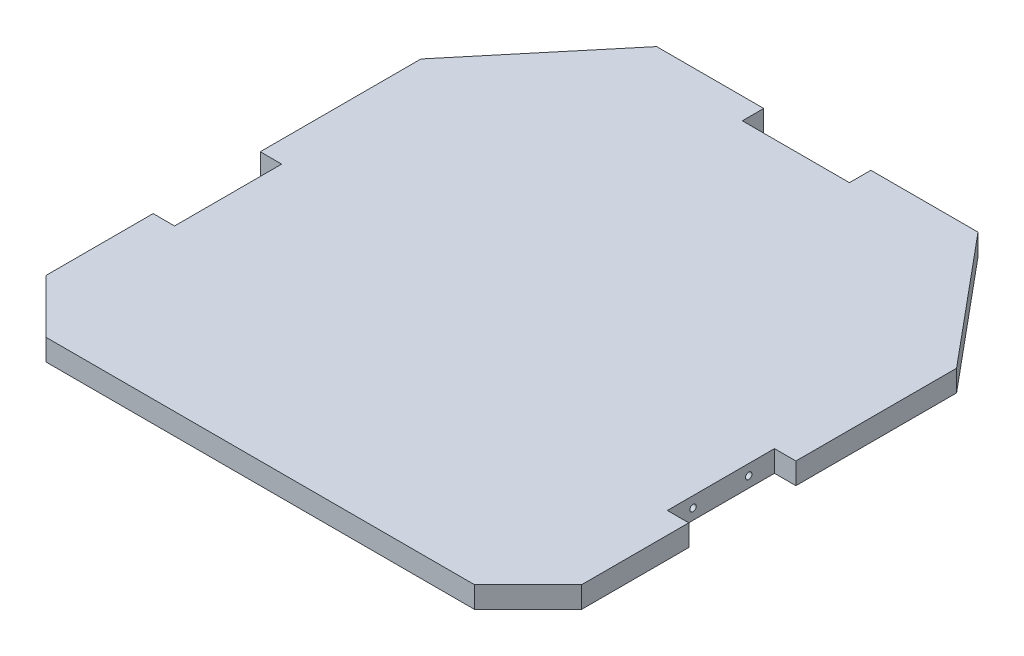
ISO-10303-21;
HEADER;
FILE_DESCRIPTION(('STEP AP214'),'2;1');
FILE_NAME('part.step','',(''),(''),'','','');
FILE_SCHEMA(('AUTOMOTIVE_DESIGN { 1 0 10303 214 1 1 1 1 }'));
ENDSEC;
DATA;
#1=APPLICATION_CONTEXT('core data for automotive mechanical design processes');
#2=APPLICATION_PROTOCOL_DEFINITION('international standard','automotive_design',2000,#1);
#3=PRODUCT_CONTEXT('',#1,'mechanical');
#4=PRODUCT('Part','Part','',(#3));
#5=PRODUCT_RELATED_PRODUCT_CATEGORY('part','',(#4));
#6=PRODUCT_DEFINITION_FORMATION('','',#4);
#7=PRODUCT_DEFINITION_CONTEXT('part definition',#1,'design');
#8=PRODUCT_DEFINITION('design','',#6,#7);
#9=PRODUCT_DEFINITION_SHAPE('','',#8);
#10=(LENGTH_UNIT() NAMED_UNIT(*) SI_UNIT(.MILLI.,.METRE.));
#11=(NAMED_UNIT(*) PLANE_ANGLE_UNIT() SI_UNIT($,.RADIAN.));
#12=(NAMED_UNIT(*) SI_UNIT($,.STERADIAN.) SOLID_ANGLE_UNIT());
#13=UNCERTAINTY_MEASURE_WITH_UNIT(LENGTH_MEASURE(1.E-05),#10,'distance_accuracy_value','');
#14=(GEOMETRIC_REPRESENTATION_CONTEXT(3) GLOBAL_UNCERTAINTY_ASSIGNED_CONTEXT((#13)) GLOBAL_UNIT_ASSIGNED_CONTEXT((#10,
#11,#12)) REPRESENTATION_CONTEXT('',''));
#15=CARTESIAN_POINT('',(0.,0.,0.));
#16=DIRECTION('',(0.,0.,1.));
#17=DIRECTION('',(1.,0.,0.));
#18=AXIS2_PLACEMENT_3D('',#15,#16,#17);
#19=CARTESIAN_POINT('',(115.,10.,-130.));
#20=DIRECTION('',(1.,0.,0.));
#21=DIRECTION('',(0.,0.,-1.));
#22=AXIS2_PLACEMENT_3D('',#19,#20,#21);
#23=PLANE('',#22);
#24=CARTESIAN_POINT('',(115.,5.,-113.));
#25=DIRECTION('',(-1.,0.,0.));
#26=DIRECTION('',(0.,0.,1.));
#27=AXIS2_PLACEMENT_3D('',#24,#25,#26);
#28=CIRCLE('',#27,1.5);
#29=CARTESIAN_POINT('',(115.,5.,-111.5));
#30=VERTEX_POINT('',#29);
#31=EDGE_CURVE('E615',#30,#30,#28,.T.);
#32=ORIENTED_EDGE('',*,*,#31,.T.);
#33=EDGE_LOOP('',(#32));
#34=FACE_BOUND('',#33,.T.);
#35=DIRECTION('',(0.,0.,1.));
#36=VECTOR('',#35,1.);
#37=CARTESIAN_POINT('',(115.,0.,-130.));
#38=LINE('',#37,#36);
#39=CARTESIAN_POINT('',(115.,0.,-125.));
#40=VERTEX_POINT('',#39);
#41=CARTESIAN_POINT('',(115.,0.,-75.));
#42=VERTEX_POINT('',#41);
#43=EDGE_CURVE('E205',#40,#42,#38,.T.);
#44=ORIENTED_EDGE('',*,*,#43,.F.);
#45=DIRECTION('',(0.,-1.,0.));
#46=VECTOR('',#45,1.);
#47=CARTESIAN_POINT('',(115.,10.,-125.));
#48=LINE('',#47,#46);
#49=CARTESIAN_POINT('',(115.,10.,-125.));
#50=VERTEX_POINT('',#49);
#51=EDGE_CURVE('E285',#50,#40,#48,.T.);
#52=ORIENTED_EDGE('',*,*,#51,.F.);
#53=DIRECTION('',(0.,0.,1.));
#54=VECTOR('',#53,1.);
#55=CARTESIAN_POINT('',(115.,10.,-130.));
#56=LINE('',#55,#54);
#57=CARTESIAN_POINT('',(115.,10.,-75.));
#58=VERTEX_POINT('',#57);
#59=EDGE_CURVE('E292',#50,#58,#56,.T.);
#60=ORIENTED_EDGE('',*,*,#59,.T.);
#61=DIRECTION('',(0.,-1.,0.));
#62=VECTOR('',#61,1.);
#63=CARTESIAN_POINT('',(115.,10.,-75.));
#64=LINE('',#63,#62);
#65=EDGE_CURVE('E42',#58,#42,#64,.T.);
#66=ORIENTED_EDGE('',*,*,#65,.T.);
#67=EDGE_LOOP('',(#44,#52,#60,#66));
#68=FACE_BOUND('',#67,.T.);
#69=CARTESIAN_POINT('',(115.,5.,-87.));
#70=DIRECTION('',(-1.,0.,0.));
#71=DIRECTION('',(0.,0.,1.));
#72=AXIS2_PLACEMENT_3D('',#69,#70,#71);
#73=CIRCLE('',#72,1.5);
#74=CARTESIAN_POINT('',(115.,5.,-85.5));
#75=VERTEX_POINT('',#74);
#76=EDGE_CURVE('E610',#75,#75,#73,.T.);
#77=ORIENTED_EDGE('',*,*,#76,.T.);
#78=EDGE_LOOP('',(#77));
#79=FACE_BOUND('',#78,.T.);
#80=ADVANCED_FACE('F33',(#34,#68,#79),#23,.T.);
#81=CARTESIAN_POINT('',(125.,10.,-130.));
#82=DIRECTION('',(1.,0.,0.));
#83=DIRECTION('',(0.,0.,-1.));
#84=AXIS2_PLACEMENT_3D('',#81,#82,#83);
#85=PLANE('',#84);
#86=DIRECTION('',(0.,0.,1.));
#87=VECTOR('',#86,1.);
#88=CARTESIAN_POINT('',(125.,0.,-130.));
#89=LINE('',#88,#87);
#90=CARTESIAN_POINT('',(125.,0.,-75.));
#91=VERTEX_POINT('',#90);
#92=CARTESIAN_POINT('',(125.,0.,-25.));
#93=VERTEX_POINT('',#92);
#94=EDGE_CURVE('E199',#91,#93,#89,.T.);
#95=ORIENTED_EDGE('',*,*,#94,.F.);
#96=DIRECTION('',(0.,-1.,0.));
#97=VECTOR('',#96,1.);
#98=CARTESIAN_POINT('',(125.,10.,-75.));
#99=LINE('',#98,#97);
#100=CARTESIAN_POINT('',(125.,10.,-75.));
#101=VERTEX_POINT('',#100);
#102=EDGE_CURVE('E11',#101,#91,#99,.T.);
#103=ORIENTED_EDGE('',*,*,#102,.F.);
#104=DIRECTION('',(0.,0.,1.));
#105=VECTOR('',#104,1.);
#106=CARTESIAN_POINT('',(125.,10.,-130.));
#107=LINE('',#106,#105);
#108=CARTESIAN_POINT('',(125.,10.,-25.));
#109=VERTEX_POINT('',#108);
#110=EDGE_CURVE('E249',#101,#109,#107,.T.);
#111=ORIENTED_EDGE('',*,*,#110,.T.);
#112=DIRECTION('',(0.,-1.,0.));
#113=VECTOR('',#112,1.);
#114=CARTESIAN_POINT('',(125.,10.,-25.));
#115=LINE('',#114,#113);
#116=EDGE_CURVE('E50',#109,#93,#115,.T.);
#117=ORIENTED_EDGE('',*,*,#116,.T.);
#118=EDGE_LOOP('',(#95,#103,#111,#117));
#119=FACE_BOUND('',#118,.T.);
#120=ADVANCED_FACE('F35',(#119),#85,.T.);
#121=CARTESIAN_POINT('',(-280.695337743088,10.,-75.));
#122=DIRECTION('',(0.,0.,-1.));
#123=DIRECTION('',(-1.,0.,0.));
#124=AXIS2_PLACEMENT_3D('',#121,#122,#123);
#125=PLANE('',#124);
#126=DIRECTION('',(1.,0.,0.));
#127=VECTOR('',#126,1.);
#128=CARTESIAN_POINT('',(-280.695337743088,0.,-75.));
#129=LINE('',#128,#127);
#130=EDGE_CURVE('E201',#42,#91,#129,.T.);
#131=ORIENTED_EDGE('',*,*,#130,.F.);
#132=ORIENTED_EDGE('',*,*,#65,.F.);
#133=DIRECTION('',(1.,0.,0.));
#134=VECTOR('',#133,1.);
#135=CARTESIAN_POINT('',(-280.695337743088,10.,-75.));
#136=LINE('',#135,#134);
#137=EDGE_CURVE('E309',#58,#101,#136,.T.);
#138=ORIENTED_EDGE('',*,*,#137,.T.);
#139=ORIENTED_EDGE('',*,*,#102,.T.);
#140=EDGE_LOOP('',(#131,#132,#138,#139));
#141=FACE_BOUND('',#140,.T.);
#142=ADVANCED_FACE('F296',(#141),#125,.T.);
#143=CARTESIAN_POINT('',(-280.695337743088,10.,-125.));
#144=DIRECTION('',(0.,0.,1.));
#145=DIRECTION('',(1.,0.,0.));
#146=AXIS2_PLACEMENT_3D('',#143,#144,#145);
#147=PLANE('',#146);
#148=DIRECTION('',(-1.,0.,0.));
#149=VECTOR('',#148,1.);
#150=CARTESIAN_POINT('',(-280.695337743088,0.,-125.));
#151=LINE('',#150,#149);
#152=CARTESIAN_POINT('',(125.,0.,-125.));
#153=VERTEX_POINT('',#152);
#154=EDGE_CURVE('E208',#153,#40,#151,.T.);
#155=ORIENTED_EDGE('',*,*,#154,.F.);
#156=DIRECTION('',(0.,-1.,0.));
#157=VECTOR('',#156,1.);
#158=CARTESIAN_POINT('',(125.,10.,-125.));
#159=LINE('',#158,#157);
#160=CARTESIAN_POINT('',(125.,10.,-125.));
#161=VERTEX_POINT('',#160);
#162=EDGE_CURVE('E283',#161,#153,#159,.T.);
#163=ORIENTED_EDGE('',*,*,#162,.F.);
#164=DIRECTION('',(-1.,0.,0.));
#165=VECTOR('',#164,1.);
#166=CARTESIAN_POINT('',(-280.695337743088,10.,-125.));
#167=LINE('',#166,#165);
#168=EDGE_CURVE('E306',#161,#50,#167,.T.);
#169=ORIENTED_EDGE('',*,*,#168,.T.);
#170=ORIENTED_EDGE('',*,*,#51,.T.);
#171=EDGE_LOOP('',(#155,#163,#169,#170));
#172=FACE_BOUND('',#171,.T.);
#173=ADVANCED_FACE('F303',(#172),#147,.T.);
#174=CARTESIAN_POINT('',(125.,10.,-130.));
#175=DIRECTION('',(1.,0.,0.));
#176=DIRECTION('',(0.,0.,-1.));
#177=AXIS2_PLACEMENT_3D('',#174,#175,#176);
#178=PLANE('',#177);
#179=DIRECTION('',(0.,0.,1.));
#180=VECTOR('',#179,1.);
#181=CARTESIAN_POINT('',(125.,0.,-130.));
#182=LINE('',#181,#180);
#183=CARTESIAN_POINT('',(125.,0.,-200.));
#184=VERTEX_POINT('',#183);
#185=EDGE_CURVE('E211',#184,#153,#182,.T.);
#186=ORIENTED_EDGE('',*,*,#185,.F.);
#187=DIRECTION('',(0.,-1.,0.));
#188=VECTOR('',#187,1.);
#189=CARTESIAN_POINT('',(125.,10.,-200.));
#190=LINE('',#189,#188);
#191=CARTESIAN_POINT('',(125.,10.,-200.));
#192=VERTEX_POINT('',#191);
#193=EDGE_CURVE('E281',#192,#184,#190,.T.);
#194=ORIENTED_EDGE('',*,*,#193,.F.);
#195=DIRECTION('',(0.,0.,1.));
#196=VECTOR('',#195,1.);
#197=CARTESIAN_POINT('',(125.,10.,-130.));
#198=LINE('',#197,#196);
#199=EDGE_CURVE('E311',#192,#161,#198,.T.);
#200=ORIENTED_EDGE('',*,*,#199,.T.);
#201=ORIENTED_EDGE('',*,*,#162,.T.);
#202=EDGE_LOOP('',(#186,#194,#200,#201));
#203=FACE_BOUND('',#202,.T.);
#204=ADVANCED_FACE('F375',(#203),#178,.T.);
#205=CARTESIAN_POINT('',(-6.84235153405244,10.,-358.210821840863));
#206=DIRECTION('',(-0.768221279597376,0.,0.64018439966448));
#207=DIRECTION('',(0.64018439966448,0.,0.768221279597376));
#208=AXIS2_PLACEMENT_3D('',#205,#206,#207);
#209=PLANE('',#208);
#210=DIRECTION('',(-0.64018439966448,0.,-0.768221279597376));
#211=VECTOR('',#210,1.);
#212=CARTESIAN_POINT('',(-6.84235153405244,0.,-358.210821840863));
#213=LINE('',#212,#211);
#214=CARTESIAN_POINT('',(75.0000000000001,0.,-260.));
#215=VERTEX_POINT('',#214);
#216=EDGE_CURVE('E214',#184,#215,#213,.T.);
#217=ORIENTED_EDGE('',*,*,#216,.T.);
#218=DIRECTION('',(0.,-1.,0.));
#219=VECTOR('',#218,1.);
#220=CARTESIAN_POINT('',(75.0000000000001,10.,-260.));
#221=LINE('',#220,#219);
#222=CARTESIAN_POINT('',(75.0000000000001,10.,-260.));
#223=VERTEX_POINT('',#222);
#224=EDGE_CURVE('E278',#223,#215,#221,.T.);
#225=ORIENTED_EDGE('',*,*,#224,.F.);
#226=DIRECTION('',(-0.64018439966448,0.,-0.768221279597376));
#227=VECTOR('',#226,1.);
#228=CARTESIAN_POINT('',(-6.84235153405244,10.,-358.210821840863));
#229=LINE('',#228,#227);
#230=EDGE_CURVE('E317',#192,#223,#229,.T.);
#231=ORIENTED_EDGE('',*,*,#230,.F.);
#232=ORIENTED_EDGE('',*,*,#193,.T.);
#233=EDGE_LOOP('',(#217,#225,#231,#232));
#234=FACE_BOUND('',#233,.T.);
#235=ADVANCED_FACE('F379',(#234),#209,.F.);
#236=CARTESIAN_POINT('',(-280.695337743088,10.,-260.));
#237=DIRECTION('',(0.,0.,1.));
#238=DIRECTION('',(1.,0.,0.));
#239=AXIS2_PLACEMENT_3D('',#236,#237,#238);
#240=PLANE('',#239);
#241=DIRECTION('',(-1.,0.,0.));
#242=VECTOR('',#241,1.);
#243=CARTESIAN_POINT('',(-280.695337743088,0.,-260.));
#244=LINE('',#243,#242);
#245=CARTESIAN_POINT('',(25.,0.,-260.));
#246=VERTEX_POINT('',#245);
#247=EDGE_CURVE('E216',#215,#246,#244,.T.);
#248=ORIENTED_EDGE('',*,*,#247,.T.);
#249=DIRECTION('',(0.,-1.,0.));
#250=VECTOR('',#249,1.);
#251=CARTESIAN_POINT('',(25.,10.,-260.));
#252=LINE('',#251,#250);
#253=CARTESIAN_POINT('',(25.,10.,-260.));
#254=VERTEX_POINT('',#253);
#255=EDGE_CURVE('E275',#254,#246,#252,.T.);
#256=ORIENTED_EDGE('',*,*,#255,.F.);
#257=DIRECTION('',(-1.,0.,0.));
#258=VECTOR('',#257,1.);
#259=CARTESIAN_POINT('',(-280.695337743088,10.,-260.));
#260=LINE('',#259,#258);
#261=EDGE_CURVE('E319',#223,#254,#260,.T.);
#262=ORIENTED_EDGE('',*,*,#261,.F.);
#263=ORIENTED_EDGE('',*,*,#224,.T.);
#264=EDGE_LOOP('',(#248,#256,#262,#263));
#265=FACE_BOUND('',#264,.T.);
#266=ADVANCED_FACE('F384',(#265),#240,.F.);
#267=CARTESIAN_POINT('',(25.0000000000002,10.,-130.));
#268=DIRECTION('',(1.,0.,0.));
#269=DIRECTION('',(0.,0.,-1.));
#270=AXIS2_PLACEMENT_3D('',#267,#268,#269);
#271=PLANE('',#270);
#272=DIRECTION('',(0.,0.,1.));
#273=VECTOR('',#272,1.);
#274=CARTESIAN_POINT('',(25.0000000000002,0.,-130.));
#275=LINE('',#274,#273);
#276=CARTESIAN_POINT('',(25.0000000000001,0.,-250.));
#277=VERTEX_POINT('',#276);
#278=EDGE_CURVE('E218',#246,#277,#275,.T.);
#279=ORIENTED_EDGE('',*,*,#278,.T.);
#280=DIRECTION('',(0.,-1.,0.));
#281=VECTOR('',#280,1.);
#282=CARTESIAN_POINT('',(25.0000000000001,10.,-250.));
#283=LINE('',#282,#281);
#284=CARTESIAN_POINT('',(25.0000000000001,10.,-250.));
#285=VERTEX_POINT('',#284);
#286=EDGE_CURVE('E273',#285,#277,#283,.T.);
#287=ORIENTED_EDGE('',*,*,#286,.F.);
#288=DIRECTION('',(0.,0.,1.));
#289=VECTOR('',#288,1.);
#290=CARTESIAN_POINT('',(25.0000000000002,10.,-130.));
#291=LINE('',#290,#289);
#292=EDGE_CURVE('E321',#254,#285,#291,.T.);
#293=ORIENTED_EDGE('',*,*,#292,.F.);
#294=ORIENTED_EDGE('',*,*,#255,.T.);
#295=EDGE_LOOP('',(#279,#287,#293,#294));
#296=FACE_BOUND('',#295,.T.);
#297=ADVANCED_FACE('F390',(#296),#271,.F.);
#298=CARTESIAN_POINT('',(-280.695337743088,10.,-250.));
#299=DIRECTION('',(0.,0.,-1.));
#300=DIRECTION('',(-1.,0.,0.));
#301=AXIS2_PLACEMENT_3D('',#298,#299,#300);
#302=PLANE('',#301);
#303=CARTESIAN_POINT('',(-13.,5.,-250.));
#304=DIRECTION('',(0.,0.,-1.));
#305=DIRECTION('',(-1.,0.,0.));
#306=AXIS2_PLACEMENT_3D('',#303,#304,#305);
#307=CIRCLE('',#306,1.5);
#308=CARTESIAN_POINT('',(-14.5000000000001,5.,-250.));
#309=VERTEX_POINT('',#308);
#310=EDGE_CURVE('E601',#309,#309,#307,.T.);
#311=ORIENTED_EDGE('',*,*,#310,.F.);
#312=EDGE_LOOP('',(#311));
#313=FACE_BOUND('',#312,.T.);
#314=CARTESIAN_POINT('',(13.0000000000001,5.,-250.));
#315=DIRECTION('',(0.,0.,-1.));
#316=DIRECTION('',(-1.,0.,0.));
#317=AXIS2_PLACEMENT_3D('',#314,#315,#316);
#318=CIRCLE('',#317,1.5);
#319=CARTESIAN_POINT('',(11.5000000000001,5.,-250.));
#320=VERTEX_POINT('',#319);
#321=EDGE_CURVE('E600',#320,#320,#318,.T.);
#322=ORIENTED_EDGE('',*,*,#321,.F.);
#323=EDGE_LOOP('',(#322));
#324=FACE_BOUND('',#323,.T.);
#325=DIRECTION('',(1.,0.,0.));
#326=VECTOR('',#325,1.);
#327=CARTESIAN_POINT('',(-280.695337743088,0.,-250.));
#328=LINE('',#327,#326);
#329=CARTESIAN_POINT('',(-25.,0.,-250.));
#330=VERTEX_POINT('',#329);
#331=EDGE_CURVE('E221',#330,#277,#328,.T.);
#332=ORIENTED_EDGE('',*,*,#331,.F.);
#333=DIRECTION('',(0.,-1.,0.));
#334=VECTOR('',#333,1.);
#335=CARTESIAN_POINT('',(-25.,10.,-250.));
#336=LINE('',#335,#334);
#337=CARTESIAN_POINT('',(-25.,10.,-250.));
#338=VERTEX_POINT('',#337);
#339=EDGE_CURVE('E271',#338,#330,#336,.T.);
#340=ORIENTED_EDGE('',*,*,#339,.F.);
#341=DIRECTION('',(1.,0.,0.));
#342=VECTOR('',#341,1.);
#343=CARTESIAN_POINT('',(-280.695337743088,10.,-250.));
#344=LINE('',#343,#342);
#345=EDGE_CURVE('E323',#338,#285,#344,.T.);
#346=ORIENTED_EDGE('',*,*,#345,.T.);
#347=ORIENTED_EDGE('',*,*,#286,.T.);
#348=EDGE_LOOP('',(#332,#340,#346,#347));
#349=FACE_BOUND('',#348,.T.);
#350=ADVANCED_FACE('F394',(#313,#324,#349),#302,.T.);
#351=CARTESIAN_POINT('',(-25.0000000000001,10.,-130.));
#352=DIRECTION('',(1.,0.,0.));
#353=DIRECTION('',(0.,0.,-1.));
#354=AXIS2_PLACEMENT_3D('',#351,#352,#353);
#355=PLANE('',#354);
#356=DIRECTION('',(0.,0.,1.));
#357=VECTOR('',#356,1.);
#358=CARTESIAN_POINT('',(-25.0000000000001,0.,-130.));
#359=LINE('',#358,#357);
#360=CARTESIAN_POINT('',(-25.,0.,-260.));
#361=VERTEX_POINT('',#360);
#362=EDGE_CURVE('E224',#361,#330,#359,.T.);
#363=ORIENTED_EDGE('',*,*,#362,.F.);
#364=DIRECTION('',(0.,-1.,0.));
#365=VECTOR('',#364,1.);
#366=CARTESIAN_POINT('',(-25.,10.,-260.));
#367=LINE('',#366,#365);
#368=CARTESIAN_POINT('',(-25.,10.,-260.));
#369=VERTEX_POINT('',#368);
#370=EDGE_CURVE('E269',#369,#361,#367,.T.);
#371=ORIENTED_EDGE('',*,*,#370,.F.);
#372=DIRECTION('',(0.,0.,1.));
#373=VECTOR('',#372,1.);
#374=CARTESIAN_POINT('',(-25.0000000000001,10.,-130.));
#375=LINE('',#374,#373);
#376=EDGE_CURVE('E326',#369,#338,#375,.T.);
#377=ORIENTED_EDGE('',*,*,#376,.T.);
#378=ORIENTED_EDGE('',*,*,#339,.T.);
#379=EDGE_LOOP('',(#363,#371,#377,#378));
#380=FACE_BOUND('',#379,.T.);
#381=ADVANCED_FACE('F398',(#380),#355,.T.);
#382=CARTESIAN_POINT('',(-280.695337743088,10.,-260.));
#383=DIRECTION('',(0.,0.,-1.));
#384=DIRECTION('',(-1.,0.,0.));
#385=AXIS2_PLACEMENT_3D('',#382,#383,#384);
#386=PLANE('',#385);
#387=DIRECTION('',(1.,0.,0.));
#388=VECTOR('',#387,1.);
#389=CARTESIAN_POINT('',(-280.695337743088,0.,-260.));
#390=LINE('',#389,#388);
#391=CARTESIAN_POINT('',(-75.,0.,-260.));
#392=VERTEX_POINT('',#391);
#393=EDGE_CURVE('E227',#392,#361,#390,.T.);
#394=ORIENTED_EDGE('',*,*,#393,.F.);
#395=DIRECTION('',(0.,-1.,0.));
#396=VECTOR('',#395,1.);
#397=CARTESIAN_POINT('',(-75.,10.,-260.));
#398=LINE('',#397,#396);
#399=CARTESIAN_POINT('',(-75.,10.,-260.));
#400=VERTEX_POINT('',#399);
#401=EDGE_CURVE('E267',#400,#392,#398,.T.);
#402=ORIENTED_EDGE('',*,*,#401,.F.);
#403=DIRECTION('',(1.,0.,0.));
#404=VECTOR('',#403,1.);
#405=CARTESIAN_POINT('',(-280.695337743088,10.,-260.));
#406=LINE('',#405,#404);
#407=EDGE_CURVE('E329',#400,#369,#406,.T.);
#408=ORIENTED_EDGE('',*,*,#407,.T.);
#409=ORIENTED_EDGE('',*,*,#370,.T.);
#410=EDGE_LOOP('',(#394,#402,#408,#409));
#411=FACE_BOUND('',#410,.T.);
#412=ADVANCED_FACE('F402',(#411),#386,.T.);
#413=CARTESIAN_POINT('',(-223.235794157003,10.,-82.1170470115961));
#414=DIRECTION('',(-0.768221279597376,0.,-0.64018439966448));
#415=DIRECTION('',(-0.64018439966448,0.,0.768221279597376));
#416=AXIS2_PLACEMENT_3D('',#413,#414,#415);
#417=PLANE('',#416);
#418=DIRECTION('',(0.64018439966448,0.,-0.768221279597376));
#419=VECTOR('',#418,1.);
#420=CARTESIAN_POINT('',(-223.235794157003,0.,-82.1170470115961));
#421=LINE('',#420,#419);
#422=CARTESIAN_POINT('',(-125.,0.,-200.));
#423=VERTEX_POINT('',#422);
#424=EDGE_CURVE('E230',#423,#392,#421,.T.);
#425=ORIENTED_EDGE('',*,*,#424,.F.);
#426=DIRECTION('',(0.,-1.,0.));
#427=VECTOR('',#426,1.);
#428=CARTESIAN_POINT('',(-125.,10.,-200.));
#429=LINE('',#428,#427);
#430=CARTESIAN_POINT('',(-125.,10.,-200.));
#431=VERTEX_POINT('',#430);
#432=EDGE_CURVE('E265',#431,#423,#429,.T.);
#433=ORIENTED_EDGE('',*,*,#432,.F.);
#434=DIRECTION('',(0.64018439966448,0.,-0.768221279597376));
#435=VECTOR('',#434,1.);
#436=CARTESIAN_POINT('',(-223.235794157003,10.,-82.1170470115961));
#437=LINE('',#436,#435);
#438=EDGE_CURVE('E332',#431,#400,#437,.T.);
#439=ORIENTED_EDGE('',*,*,#438,.T.);
#440=ORIENTED_EDGE('',*,*,#401,.T.);
#441=EDGE_LOOP('',(#425,#433,#439,#440));
#442=FACE_BOUND('',#441,.T.);
#443=ADVANCED_FACE('F406',(#442),#417,.T.);
#444=CARTESIAN_POINT('',(-125.,10.,-130.));
#445=DIRECTION('',(1.,0.,0.));
#446=DIRECTION('',(0.,0.,-1.));
#447=AXIS2_PLACEMENT_3D('',#444,#445,#446);
#448=PLANE('',#447);
#449=DIRECTION('',(0.,0.,1.));
#450=VECTOR('',#449,1.);
#451=CARTESIAN_POINT('',(-125.,0.,-130.));
#452=LINE('',#451,#450);
#453=CARTESIAN_POINT('',(-125.,0.,-125.));
#454=VERTEX_POINT('',#453);
#455=EDGE_CURVE('E233',#423,#454,#452,.T.);
#456=ORIENTED_EDGE('',*,*,#455,.T.);
#457=DIRECTION('',(0.,-1.,0.));
#458=VECTOR('',#457,1.);
#459=CARTESIAN_POINT('',(-125.,10.,-125.));
#460=LINE('',#459,#458);
#461=CARTESIAN_POINT('',(-125.,10.,-125.));
#462=VERTEX_POINT('',#461);
#463=EDGE_CURVE('E262',#462,#454,#460,.T.);
#464=ORIENTED_EDGE('',*,*,#463,.F.);
#465=DIRECTION('',(0.,0.,1.));
#466=VECTOR('',#465,1.);
#467=CARTESIAN_POINT('',(-125.,10.,-130.));
#468=LINE('',#467,#466);
#469=EDGE_CURVE('E335',#431,#462,#468,.T.);
#470=ORIENTED_EDGE('',*,*,#469,.F.);
#471=ORIENTED_EDGE('',*,*,#432,.T.);
#472=EDGE_LOOP('',(#456,#464,#470,#471));
#473=FACE_BOUND('',#472,.T.);
#474=ADVANCED_FACE('F410',(#473),#448,.F.);
#475=CARTESIAN_POINT('',(-280.695337743088,10.,-125.));
#476=DIRECTION('',(0.,0.,-1.));
#477=DIRECTION('',(-1.,0.,0.));
#478=AXIS2_PLACEMENT_3D('',#475,#476,#477);
#479=PLANE('',#478);
#480=DIRECTION('',(1.,0.,0.));
#481=VECTOR('',#480,1.);
#482=CARTESIAN_POINT('',(-280.695337743088,0.,-125.));
#483=LINE('',#482,#481);
#484=CARTESIAN_POINT('',(-115.,0.,-125.));
#485=VERTEX_POINT('',#484);
#486=EDGE_CURVE('E235',#454,#485,#483,.T.);
#487=ORIENTED_EDGE('',*,*,#486,.T.);
#488=DIRECTION('',(0.,-1.,0.));
#489=VECTOR('',#488,1.);
#490=CARTESIAN_POINT('',(-115.,10.,-125.));
#491=LINE('',#490,#489);
#492=CARTESIAN_POINT('',(-115.,10.,-125.));
#493=VERTEX_POINT('',#492);
#494=EDGE_CURVE('E259',#493,#485,#491,.T.);
#495=ORIENTED_EDGE('',*,*,#494,.F.);
#496=DIRECTION('',(1.,0.,0.));
#497=VECTOR('',#496,1.);
#498=CARTESIAN_POINT('',(-280.695337743088,10.,-125.));
#499=LINE('',#498,#497);
#500=EDGE_CURVE('E337',#462,#493,#499,.T.);
#501=ORIENTED_EDGE('',*,*,#500,.F.);
#502=ORIENTED_EDGE('',*,*,#463,.T.);
#503=EDGE_LOOP('',(#487,#495,#501,#502));
#504=FACE_BOUND('',#503,.T.);
#505=ADVANCED_FACE('F414',(#504),#479,.F.);
#506=CARTESIAN_POINT('',(-115.,10.,-130.));
#507=DIRECTION('',(1.,0.,0.));
#508=DIRECTION('',(0.,0.,-1.));
#509=AXIS2_PLACEMENT_3D('',#506,#507,#508);
#510=PLANE('',#509);
#511=CARTESIAN_POINT('',(-115.,5.,-87.));
#512=DIRECTION('',(-1.,0.,0.));
#513=DIRECTION('',(0.,0.,1.));
#514=AXIS2_PLACEMENT_3D('',#511,#512,#513);
#515=CIRCLE('',#514,1.5);
#516=CARTESIAN_POINT('',(-115.,5.,-85.5));
#517=VERTEX_POINT('',#516);
#518=EDGE_CURVE('E621',#517,#517,#515,.T.);
#519=ORIENTED_EDGE('',*,*,#518,.F.);
#520=EDGE_LOOP('',(#519));
#521=FACE_BOUND('',#520,.T.);
#522=CARTESIAN_POINT('',(-115.,5.,-113.));
#523=DIRECTION('',(-1.,0.,0.));
#524=DIRECTION('',(0.,0.,1.));
#525=AXIS2_PLACEMENT_3D('',#522,#523,#524);
#526=CIRCLE('',#525,1.5);
#527=CARTESIAN_POINT('',(-115.,5.,-111.5));
#528=VERTEX_POINT('',#527);
#529=EDGE_CURVE('E626',#528,#528,#526,.T.);
#530=ORIENTED_EDGE('',*,*,#529,.F.);
#531=EDGE_LOOP('',(#530));
#532=FACE_BOUND('',#531,.T.);
#533=DIRECTION('',(0.,0.,1.));
#534=VECTOR('',#533,1.);
#535=CARTESIAN_POINT('',(-115.,0.,-130.));
#536=LINE('',#535,#534);
#537=CARTESIAN_POINT('',(-115.,0.,-75.));
#538=VERTEX_POINT('',#537);
#539=EDGE_CURVE('E237',#485,#538,#536,.T.);
#540=ORIENTED_EDGE('',*,*,#539,.T.);
#541=DIRECTION('',(0.,-1.,0.));
#542=VECTOR('',#541,1.);
#543=CARTESIAN_POINT('',(-115.,10.,-75.));
#544=LINE('',#543,#542);
#545=CARTESIAN_POINT('',(-115.,10.,-75.));
#546=VERTEX_POINT('',#545);
#547=EDGE_CURVE('E256',#546,#538,#544,.T.);
#548=ORIENTED_EDGE('',*,*,#547,.F.);
#549=DIRECTION('',(0.,0.,1.));
#550=VECTOR('',#549,1.);
#551=CARTESIAN_POINT('',(-115.,10.,-130.));
#552=LINE('',#551,#550);
#553=EDGE_CURVE('E339',#493,#546,#552,.T.);
#554=ORIENTED_EDGE('',*,*,#553,.F.);
#555=ORIENTED_EDGE('',*,*,#494,.T.);
#556=EDGE_LOOP('',(#540,#548,#554,#555));
#557=FACE_BOUND('',#556,.T.);
#558=ADVANCED_FACE('F418',(#521,#532,#557),#510,.F.);
#559=CARTESIAN_POINT('',(-280.695337743088,10.,-75.));
#560=DIRECTION('',(0.,0.,1.));
#561=DIRECTION('',(1.,0.,0.));
#562=AXIS2_PLACEMENT_3D('',#559,#560,#561);
#563=PLANE('',#562);
#564=DIRECTION('',(-1.,0.,0.));
#565=VECTOR('',#564,1.);
#566=CARTESIAN_POINT('',(-280.695337743088,0.,-75.));
#567=LINE('',#566,#565);
#568=CARTESIAN_POINT('',(-125.,0.,-75.));
#569=VERTEX_POINT('',#568);
#570=EDGE_CURVE('E239',#538,#569,#567,.T.);
#571=ORIENTED_EDGE('',*,*,#570,.T.);
#572=DIRECTION('',(0.,-1.,0.));
#573=VECTOR('',#572,1.);
#574=CARTESIAN_POINT('',(-125.,10.,-75.));
#575=LINE('',#574,#573);
#576=CARTESIAN_POINT('',(-125.,10.,-75.));
#577=VERTEX_POINT('',#576);
#578=EDGE_CURVE('E253',#577,#569,#575,.T.);
#579=ORIENTED_EDGE('',*,*,#578,.F.);
#580=DIRECTION('',(-1.,0.,0.));
#581=VECTOR('',#580,1.);
#582=CARTESIAN_POINT('',(-280.695337743088,10.,-75.));
#583=LINE('',#582,#581);
#584=EDGE_CURVE('E341',#546,#577,#583,.T.);
#585=ORIENTED_EDGE('',*,*,#584,.F.);
#586=ORIENTED_EDGE('',*,*,#547,.T.);
#587=EDGE_LOOP('',(#571,#579,#585,#586));
#588=FACE_BOUND('',#587,.T.);
#589=ADVANCED_FACE('F347',(#588),#563,.F.);
#590=CARTESIAN_POINT('',(-125.,10.,-130.));
#591=DIRECTION('',(1.,0.,0.));
#592=DIRECTION('',(0.,0.,-1.));
#593=AXIS2_PLACEMENT_3D('',#590,#591,#592);
#594=PLANE('',#593);
#595=DIRECTION('',(0.,0.,1.));
#596=VECTOR('',#595,1.);
#597=CARTESIAN_POINT('',(-125.,0.,-130.));
#598=LINE('',#597,#596);
#599=CARTESIAN_POINT('',(-125.,0.,-25.));
#600=VERTEX_POINT('',#599);
#601=EDGE_CURVE('E241',#569,#600,#598,.T.);
#602=ORIENTED_EDGE('',*,*,#601,.T.);
#603=DIRECTION('',(0.,-1.,0.));
#604=VECTOR('',#603,1.);
#605=CARTESIAN_POINT('',(-125.,10.,-25.));
#606=LINE('',#605,#604);
#607=CARTESIAN_POINT('',(-125.,10.,-25.));
#608=VERTEX_POINT('',#607);
#609=EDGE_CURVE('E191',#608,#600,#606,.T.);
#610=ORIENTED_EDGE('',*,*,#609,.F.);
#611=DIRECTION('',(0.,0.,1.));
#612=VECTOR('',#611,1.);
#613=CARTESIAN_POINT('',(-125.,10.,-130.));
#614=LINE('',#613,#612);
#615=EDGE_CURVE('E179',#577,#608,#614,.T.);
#616=ORIENTED_EDGE('',*,*,#615,.F.);
#617=ORIENTED_EDGE('',*,*,#578,.T.);
#618=EDGE_LOOP('',(#602,#610,#616,#617));
#619=FACE_BOUND('',#618,.T.);
#620=ADVANCED_FACE('F351',(#619),#594,.F.);
#621=CARTESIAN_POINT('',(-255.347668871544,10.,-155.347668871544));
#622=DIRECTION('',(0.707106781186548,0.,-0.707106781186547));
#623=DIRECTION('',(-0.707106781186547,0.,-0.707106781186548));
#624=AXIS2_PLACEMENT_3D('',#621,#622,#623);
#625=PLANE('',#624);
#626=DIRECTION('',(0.707106781186547,0.,0.707106781186548));
#627=VECTOR('',#626,1.);
#628=CARTESIAN_POINT('',(-255.347668871544,0.,-155.347668871544));
#629=LINE('',#628,#627);
#630=CARTESIAN_POINT('',(-100.,0.,0.));
#631=VERTEX_POINT('',#630);
#632=EDGE_CURVE('E188',#600,#631,#629,.T.);
#633=ORIENTED_EDGE('',*,*,#632,.T.);
#634=DIRECTION('',(0.,-1.,0.));
#635=VECTOR('',#634,1.);
#636=CARTESIAN_POINT('',(-100.,10.,0.));
#637=LINE('',#636,#635);
#638=CARTESIAN_POINT('',(-100.,10.,0.));
#639=VERTEX_POINT('',#638);
#640=EDGE_CURVE('E185',#639,#631,#637,.T.);
#641=ORIENTED_EDGE('',*,*,#640,.F.);
#642=DIRECTION('',(0.707106781186547,0.,0.707106781186548));
#643=VECTOR('',#642,1.);
#644=CARTESIAN_POINT('',(-255.347668871544,10.,-155.347668871544));
#645=LINE('',#644,#643);
#646=EDGE_CURVE('E172',#608,#639,#645,.T.);
#647=ORIENTED_EDGE('',*,*,#646,.F.);
#648=ORIENTED_EDGE('',*,*,#609,.T.);
#649=EDGE_LOOP('',(#633,#641,#647,#648));
#650=FACE_BOUND('',#649,.T.);
#651=ADVANCED_FACE('F186',(#650),#625,.F.);
#652=CARTESIAN_POINT('',(-280.695337743088,10.,0.));
#653=DIRECTION('',(0.,0.,-1.));
#654=DIRECTION('',(-1.,0.,0.));
#655=AXIS2_PLACEMENT_3D('',#652,#653,#654);
#656=PLANE('',#655);
#657=DIRECTION('',(1.,0.,0.));
#658=VECTOR('',#657,1.);
#659=CARTESIAN_POINT('',(-280.695337743088,0.,0.));
#660=LINE('',#659,#658);
#661=CARTESIAN_POINT('',(100.,0.,0.));
#662=VERTEX_POINT('',#661);
#663=EDGE_CURVE('E244',#631,#662,#660,.T.);
#664=ORIENTED_EDGE('',*,*,#663,.T.);
#665=DIRECTION('',(0.,-1.,0.));
#666=VECTOR('',#665,1.);
#667=CARTESIAN_POINT('',(100.,10.,0.));
#668=LINE('',#667,#666);
#669=CARTESIAN_POINT('',(100.,10.,0.));
#670=VERTEX_POINT('',#669);
#671=EDGE_CURVE('E112',#670,#662,#668,.T.);
#672=ORIENTED_EDGE('',*,*,#671,.F.);
#673=DIRECTION('',(1.,0.,0.));
#674=VECTOR('',#673,1.);
#675=CARTESIAN_POINT('',(-280.695337743088,10.,0.));
#676=LINE('',#675,#674);
#677=EDGE_CURVE('E177',#639,#670,#676,.T.);
#678=ORIENTED_EDGE('',*,*,#677,.F.);
#679=ORIENTED_EDGE('',*,*,#640,.T.);
#680=EDGE_LOOP('',(#664,#672,#678,#679));
#681=FACE_BOUND('',#680,.T.);
#682=ADVANCED_FACE('F193',(#681),#656,.F.);
#683=CARTESIAN_POINT('',(-25.3476688715439,10.,125.347668871544));
#684=DIRECTION('',(0.707106781186548,0.,0.707106781186547));
#685=DIRECTION('',(0.707106781186547,0.,-0.707106781186548));
#686=AXIS2_PLACEMENT_3D('',#683,#684,#685);
#687=PLANE('',#686);
#688=DIRECTION('',(-0.707106781186547,0.,0.707106781186548));
#689=VECTOR('',#688,1.);
#690=CARTESIAN_POINT('',(-25.3476688715439,0.,125.347668871544));
#691=LINE('',#690,#689);
#692=EDGE_CURVE('E246',#93,#662,#691,.T.);
#693=ORIENTED_EDGE('',*,*,#692,.F.);
#694=ORIENTED_EDGE('',*,*,#116,.F.);
#695=DIRECTION('',(-0.707106781186547,0.,0.707106781186548));
#696=VECTOR('',#695,1.);
#697=CARTESIAN_POINT('',(-25.3476688715439,10.,125.347668871544));
#698=LINE('',#697,#696);
#699=EDGE_CURVE('E194',#109,#670,#698,.T.);
#700=ORIENTED_EDGE('',*,*,#699,.T.);
#701=ORIENTED_EDGE('',*,*,#671,.T.);
#702=EDGE_LOOP('',(#693,#694,#700,#701));
#703=FACE_BOUND('',#702,.T.);
#704=ADVANCED_FACE('F352',(#703),#687,.T.);
#705=CARTESIAN_POINT('',(-280.695337743088,10.,-130.));
#706=DIRECTION('',(0.,1.,0.));
#707=DIRECTION('',(0.,0.,1.));
#708=AXIS2_PLACEMENT_3D('',#705,#706,#707);
#709=PLANE('',#708);
#710=ORIENTED_EDGE('',*,*,#110,.F.);
#711=ORIENTED_EDGE('',*,*,#137,.F.);
#712=ORIENTED_EDGE('',*,*,#59,.F.);
#713=ORIENTED_EDGE('',*,*,#168,.F.);
#714=ORIENTED_EDGE('',*,*,#199,.F.);
#715=ORIENTED_EDGE('',*,*,#230,.T.);
#716=ORIENTED_EDGE('',*,*,#261,.T.);
#717=ORIENTED_EDGE('',*,*,#292,.T.);
#718=ORIENTED_EDGE('',*,*,#345,.F.);
#719=ORIENTED_EDGE('',*,*,#376,.F.);
#720=ORIENTED_EDGE('',*,*,#407,.F.);
#721=ORIENTED_EDGE('',*,*,#438,.F.);
#722=ORIENTED_EDGE('',*,*,#469,.T.);
#723=ORIENTED_EDGE('',*,*,#500,.T.);
#724=ORIENTED_EDGE('',*,*,#553,.T.);
#725=ORIENTED_EDGE('',*,*,#584,.T.);
#726=ORIENTED_EDGE('',*,*,#615,.T.);
#727=ORIENTED_EDGE('',*,*,#646,.T.);
#728=ORIENTED_EDGE('',*,*,#677,.T.);
#729=ORIENTED_EDGE('',*,*,#699,.F.);
#730=EDGE_LOOP('',(#710,#711,#712,#713,#714,#715,#716,#717,#718,#719,#720,#721,#722,#723,#724,
#725,#726,#727,#728,#729));
#731=FACE_BOUND('',#730,.T.);
#732=ADVANCED_FACE('F174',(#731),#709,.T.);
#733=CARTESIAN_POINT('',(-280.695337743088,0.,-130.));
#734=DIRECTION('',(0.,1.,0.));
#735=DIRECTION('',(0.,0.,1.));
#736=AXIS2_PLACEMENT_3D('',#733,#734,#735);
#737=PLANE('',#736);
#738=ORIENTED_EDGE('',*,*,#94,.T.);
#739=ORIENTED_EDGE('',*,*,#692,.T.);
#740=ORIENTED_EDGE('',*,*,#663,.F.);
#741=ORIENTED_EDGE('',*,*,#632,.F.);
#742=ORIENTED_EDGE('',*,*,#601,.F.);
#743=ORIENTED_EDGE('',*,*,#570,.F.);
#744=ORIENTED_EDGE('',*,*,#539,.F.);
#745=ORIENTED_EDGE('',*,*,#486,.F.);
#746=ORIENTED_EDGE('',*,*,#455,.F.);
#747=ORIENTED_EDGE('',*,*,#424,.T.);
#748=ORIENTED_EDGE('',*,*,#393,.T.);
#749=ORIENTED_EDGE('',*,*,#362,.T.);
#750=ORIENTED_EDGE('',*,*,#331,.T.);
#751=ORIENTED_EDGE('',*,*,#278,.F.);
#752=ORIENTED_EDGE('',*,*,#247,.F.);
#753=ORIENTED_EDGE('',*,*,#216,.F.);
#754=ORIENTED_EDGE('',*,*,#185,.T.);
#755=ORIENTED_EDGE('',*,*,#154,.T.);
#756=ORIENTED_EDGE('',*,*,#43,.T.);
#757=ORIENTED_EDGE('',*,*,#130,.T.);
#758=EDGE_LOOP('',(#738,#739,#740,#741,#742,#743,#744,#745,#746,#747,#748,#749,#750,#751,#752,
#753,#754,#755,#756,#757));
#759=FACE_BOUND('',#758,.T.);
#760=ADVANCED_FACE('F298',(#759),#737,.F.);
#761=CARTESIAN_POINT('',(-100.,5.,-113.));
#762=DIRECTION('',(-1.,0.,0.));
#763=DIRECTION('',(0.,0.,1.));
#764=AXIS2_PLACEMENT_3D('',#761,#762,#763);
#765=CYLINDRICAL_SURFACE('',#764,1.5);
#766=CARTESIAN_POINT('',(-100.,5.,-113.));
#767=DIRECTION('',(-1.,0.,0.));
#768=DIRECTION('',(0.,0.,1.));
#769=AXIS2_PLACEMENT_3D('',#766,#767,#768);
#770=CIRCLE('',#769,1.5);
#771=CARTESIAN_POINT('',(-100.,5.,-111.5));
#772=VERTEX_POINT('',#771);
#773=EDGE_CURVE('E202',#772,#772,#770,.T.);
#774=ORIENTED_EDGE('',*,*,#773,.F.);
#775=EDGE_LOOP('',(#774));
#776=FACE_BOUND('',#775,.T.);
#777=ORIENTED_EDGE('',*,*,#529,.T.);
#778=EDGE_LOOP('',(#777));
#779=FACE_BOUND('',#778,.T.);
#780=ADVANCED_FACE('F455',(#776,#779),#765,.F.);
#781=CARTESIAN_POINT('',(-100.,5.,-113.));
#782=DIRECTION('',(-1.,0.,0.));
#783=DIRECTION('',(0.,0.,1.));
#784=AXIS2_PLACEMENT_3D('',#781,#782,#783);
#785=PLANE('',#784);
#786=ORIENTED_EDGE('',*,*,#773,.T.);
#787=EDGE_LOOP('',(#786));
#788=FACE_BOUND('',#787,.T.);
#789=ADVANCED_FACE('F471',(#788),#785,.T.);
#790=CARTESIAN_POINT('',(-100.,5.,-87.));
#791=DIRECTION('',(-1.,0.,0.));
#792=DIRECTION('',(0.,0.,1.));
#793=AXIS2_PLACEMENT_3D('',#790,#791,#792);
#794=CYLINDRICAL_SURFACE('',#793,1.5);
#795=CARTESIAN_POINT('',(-100.,5.,-87.));
#796=DIRECTION('',(-1.,0.,0.));
#797=DIRECTION('',(0.,0.,1.));
#798=AXIS2_PLACEMENT_3D('',#795,#796,#797);
#799=CIRCLE('',#798,1.5);
#800=CARTESIAN_POINT('',(-100.,5.,-85.5));
#801=VERTEX_POINT('',#800);
#802=EDGE_CURVE('E623',#801,#801,#799,.T.);
#803=ORIENTED_EDGE('',*,*,#802,.F.);
#804=EDGE_LOOP('',(#803));
#805=FACE_BOUND('',#804,.T.);
#806=ORIENTED_EDGE('',*,*,#518,.T.);
#807=EDGE_LOOP('',(#806));
#808=FACE_BOUND('',#807,.T.);
#809=ADVANCED_FACE('F481',(#805,#808),#794,.F.);
#810=CARTESIAN_POINT('',(-100.,5.,-87.));
#811=DIRECTION('',(-1.,0.,0.));
#812=DIRECTION('',(0.,0.,1.));
#813=AXIS2_PLACEMENT_3D('',#810,#811,#812);
#814=PLANE('',#813);
#815=ORIENTED_EDGE('',*,*,#802,.T.);
#816=EDGE_LOOP('',(#815));
#817=FACE_BOUND('',#816,.T.);
#818=ADVANCED_FACE('F491',(#817),#814,.T.);
#819=CARTESIAN_POINT('',(100.,5.,-113.));
#820=DIRECTION('',(1.,0.,0.));
#821=DIRECTION('',(0.,0.,-1.));
#822=AXIS2_PLACEMENT_3D('',#819,#820,#821);
#823=CYLINDRICAL_SURFACE('',#822,1.5);
#824=CARTESIAN_POINT('',(100.,5.,-113.));
#825=DIRECTION('',(-1.,0.,0.));
#826=DIRECTION('',(0.,0.,1.));
#827=AXIS2_PLACEMENT_3D('',#824,#825,#826);
#828=CIRCLE('',#827,1.5);
#829=CARTESIAN_POINT('',(100.,5.,-111.5));
#830=VERTEX_POINT('',#829);
#831=EDGE_CURVE('E618',#830,#830,#828,.T.);
#832=ORIENTED_EDGE('',*,*,#831,.T.);
#833=EDGE_LOOP('',(#832));
#834=FACE_BOUND('',#833,.T.);
#835=ORIENTED_EDGE('',*,*,#31,.F.);
#836=EDGE_LOOP('',(#835));
#837=FACE_BOUND('',#836,.T.);
#838=ADVANCED_FACE('F500',(#834,#837),#823,.F.);
#839=CARTESIAN_POINT('',(100.,5.,-113.));
#840=DIRECTION('',(1.,0.,0.));
#841=DIRECTION('',(0.,0.,1.));
#842=AXIS2_PLACEMENT_3D('',#839,#840,#841);
#843=PLANE('',#842);
#844=ORIENTED_EDGE('',*,*,#831,.F.);
#845=EDGE_LOOP('',(#844));
#846=FACE_BOUND('',#845,.T.);
#847=ADVANCED_FACE('F515',(#846),#843,.T.);
#848=CARTESIAN_POINT('',(100.,5.,-87.));
#849=DIRECTION('',(1.,0.,0.));
#850=DIRECTION('',(0.,0.,-1.));
#851=AXIS2_PLACEMENT_3D('',#848,#849,#850);
#852=CYLINDRICAL_SURFACE('',#851,1.5);
#853=CARTESIAN_POINT('',(100.,5.,-87.));
#854=DIRECTION('',(-1.,0.,0.));
#855=DIRECTION('',(0.,0.,1.));
#856=AXIS2_PLACEMENT_3D('',#853,#854,#855);
#857=CIRCLE('',#856,1.5);
#858=CARTESIAN_POINT('',(100.,5.,-85.5));
#859=VERTEX_POINT('',#858);
#860=EDGE_CURVE('E612',#859,#859,#857,.T.);
#861=ORIENTED_EDGE('',*,*,#860,.T.);
#862=EDGE_LOOP('',(#861));
#863=FACE_BOUND('',#862,.T.);
#864=ORIENTED_EDGE('',*,*,#76,.F.);
#865=EDGE_LOOP('',(#864));
#866=FACE_BOUND('',#865,.T.);
#867=ADVANCED_FACE('F525',(#863,#866),#852,.F.);
#868=CARTESIAN_POINT('',(100.,5.,-87.));
#869=DIRECTION('',(1.,0.,0.));
#870=DIRECTION('',(0.,0.,1.));
#871=AXIS2_PLACEMENT_3D('',#868,#869,#870);
#872=PLANE('',#871);
#873=ORIENTED_EDGE('',*,*,#860,.F.);
#874=EDGE_LOOP('',(#873));
#875=FACE_BOUND('',#874,.T.);
#876=ADVANCED_FACE('F535',(#875),#872,.T.);
#877=CARTESIAN_POINT('',(13.0000000000001,5.,-235.));
#878=DIRECTION('',(0.,0.,-1.));
#879=DIRECTION('',(-1.,0.,0.));
#880=AXIS2_PLACEMENT_3D('',#877,#878,#879);
#881=CYLINDRICAL_SURFACE('',#880,1.5);
#882=CARTESIAN_POINT('',(13.0000000000001,5.,-235.));
#883=DIRECTION('',(0.,0.,-1.));
#884=DIRECTION('',(-1.,0.,0.));
#885=AXIS2_PLACEMENT_3D('',#882,#883,#884);
#886=CIRCLE('',#885,1.5);
#887=CARTESIAN_POINT('',(11.5000000000001,5.,-235.));
#888=VERTEX_POINT('',#887);
#889=EDGE_CURVE('E604',#888,#888,#886,.T.);
#890=ORIENTED_EDGE('',*,*,#889,.F.);
#891=EDGE_LOOP('',(#890));
#892=FACE_BOUND('',#891,.T.);
#893=ORIENTED_EDGE('',*,*,#321,.T.);
#894=EDGE_LOOP('',(#893));
#895=FACE_BOUND('',#894,.T.);
#896=ADVANCED_FACE('F545',(#892,#895),#881,.F.);
#897=CARTESIAN_POINT('',(13.0000000000001,5.,-235.));
#898=DIRECTION('',(0.,0.,-1.));
#899=DIRECTION('',(-1.,0.,0.));
#900=AXIS2_PLACEMENT_3D('',#897,#898,#899);
#901=PLANE('',#900);
#902=ORIENTED_EDGE('',*,*,#889,.T.);
#903=EDGE_LOOP('',(#902));
#904=FACE_BOUND('',#903,.T.);
#905=ADVANCED_FACE('F563',(#904),#901,.T.);
#906=CARTESIAN_POINT('',(-13.,5.,-235.));
#907=DIRECTION('',(0.,0.,-1.));
#908=DIRECTION('',(-1.,0.,0.));
#909=AXIS2_PLACEMENT_3D('',#906,#907,#908);
#910=CYLINDRICAL_SURFACE('',#909,1.5);
#911=CARTESIAN_POINT('',(-13.,5.,-235.));
#912=DIRECTION('',(0.,0.,-1.));
#913=DIRECTION('',(-1.,0.,0.));
#914=AXIS2_PLACEMENT_3D('',#911,#912,#913);
#915=CIRCLE('',#914,1.5);
#916=CARTESIAN_POINT('',(-14.5000000000001,5.,-235.));
#917=VERTEX_POINT('',#916);
#918=EDGE_CURVE('E599',#917,#917,#915,.T.);
#919=ORIENTED_EDGE('',*,*,#918,.F.);
#920=EDGE_LOOP('',(#919));
#921=FACE_BOUND('',#920,.T.);
#922=ORIENTED_EDGE('',*,*,#310,.T.);
#923=EDGE_LOOP('',(#922));
#924=FACE_BOUND('',#923,.T.);
#925=ADVANCED_FACE('F573',(#921,#924),#910,.F.);
#926=CARTESIAN_POINT('',(-13.,5.,-235.));
#927=DIRECTION('',(0.,0.,-1.));
#928=DIRECTION('',(-1.,0.,0.));
#929=AXIS2_PLACEMENT_3D('',#926,#927,#928);
#930=PLANE('',#929);
#931=ORIENTED_EDGE('',*,*,#918,.T.);
#932=EDGE_LOOP('',(#931));
#933=FACE_BOUND('',#932,.T.);
#934=ADVANCED_FACE('F583',(#933),#930,.T.);
#935=CLOSED_SHELL('',(#80,#120,#142,#173,#204,#235,#266,#297,#350,#381,#412,#443,#474,#505,#558,
#589,#620,#651,#682,#704,#732,#760,#780,#789,#809,#818,#838,#847,#867,#876,#896,#905,#925,#934));
#936=MANIFOLD_SOLID_BREP('B2',#935);
#937=ADVANCED_BREP_SHAPE_REPRESENTATION('',(#18,#936),#14);
#938=SHAPE_DEFINITION_REPRESENTATION(#9,#937);
ENDSEC;
END-ISO-10303-21;
